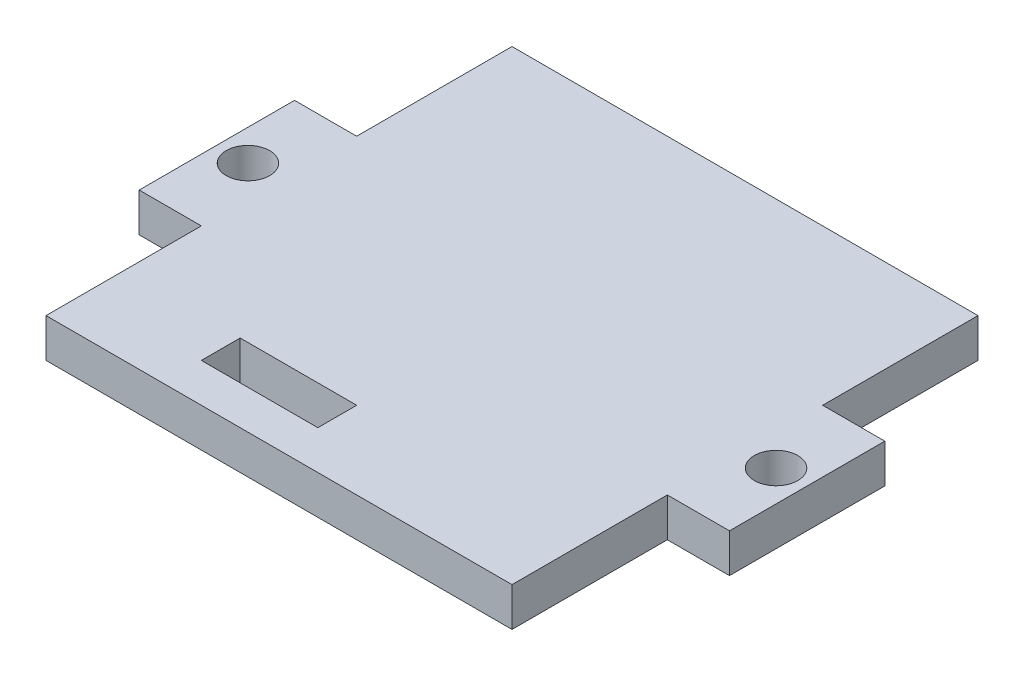
ISO-10303-21;
HEADER;
FILE_DESCRIPTION(('STEP AP214'),'2;1');
FILE_NAME('part.step','',(''),(''),'','','');
FILE_SCHEMA(('AUTOMOTIVE_DESIGN { 1 0 10303 214 1 1 1 1 }'));
ENDSEC;
DATA;
#1=APPLICATION_CONTEXT('core data for automotive mechanical design processes');
#2=APPLICATION_PROTOCOL_DEFINITION('international standard','automotive_design',2000,#1);
#3=PRODUCT_CONTEXT('',#1,'mechanical');
#4=PRODUCT('Part','Part','',(#3));
#5=PRODUCT_RELATED_PRODUCT_CATEGORY('part','',(#4));
#6=PRODUCT_DEFINITION_FORMATION('','',#4);
#7=PRODUCT_DEFINITION_CONTEXT('part definition',#1,'design');
#8=PRODUCT_DEFINITION('design','',#6,#7);
#9=PRODUCT_DEFINITION_SHAPE('','',#8);
#10=(LENGTH_UNIT() NAMED_UNIT(*) SI_UNIT(.MILLI.,.METRE.));
#11=(NAMED_UNIT(*) PLANE_ANGLE_UNIT() SI_UNIT($,.RADIAN.));
#12=(NAMED_UNIT(*) SI_UNIT($,.STERADIAN.) SOLID_ANGLE_UNIT());
#13=UNCERTAINTY_MEASURE_WITH_UNIT(LENGTH_MEASURE(1.E-05),#10,'distance_accuracy_value','');
#14=(GEOMETRIC_REPRESENTATION_CONTEXT(3) GLOBAL_UNCERTAINTY_ASSIGNED_CONTEXT((#13)) GLOBAL_UNIT_ASSIGNED_CONTEXT((#10,
#11,#12)) REPRESENTATION_CONTEXT('',''));
#15=CARTESIAN_POINT('',(0.,0.,0.));
#16=DIRECTION('',(0.,0.,1.));
#17=DIRECTION('',(1.,0.,0.));
#18=AXIS2_PLACEMENT_3D('',#15,#16,#17);
#19=CARTESIAN_POINT('',(0.,3.175,0.));
#20=DIRECTION('',(0.,-1.,0.));
#21=DIRECTION('',(0.,0.,-1.));
#22=AXIS2_PLACEMENT_3D('',#19,#20,#21);
#23=PLANE('',#22);
#24=CARTESIAN_POINT('',(40.64,3.175,-19.05));
#25=DIRECTION('',(0.,1.,0.));
#26=DIRECTION('',(0.,0.,1.));
#27=AXIS2_PLACEMENT_3D('',#24,#25,#26);
#28=CIRCLE('',#27,1.778);
#29=CARTESIAN_POINT('',(40.64,3.175,-17.272));
#30=VERTEX_POINT('',#29);
#31=EDGE_CURVE('E182',#30,#30,#28,.T.);
#32=ORIENTED_EDGE('',*,*,#31,.F.);
#33=EDGE_LOOP('',(#32));
#34=FACE_BOUND('',#33,.T.);
#35=DIRECTION('',(1.,0.,0.));
#36=VECTOR('',#35,1.);
#37=CARTESIAN_POINT('',(38.1,3.175,0.));
#38=LINE('',#37,#36);
#39=CARTESIAN_POINT('',(0.,3.175,0.));
#40=VERTEX_POINT('',#39);
#41=CARTESIAN_POINT('',(38.1,3.175,0.));
#42=VERTEX_POINT('',#41);
#43=EDGE_CURVE('E194',#40,#42,#38,.T.);
#44=ORIENTED_EDGE('',*,*,#43,.T.);
#45=DIRECTION('',(0.,0.,-1.));
#46=VECTOR('',#45,1.);
#47=CARTESIAN_POINT('',(38.1,3.175,-12.7));
#48=LINE('',#47,#46);
#49=CARTESIAN_POINT('',(38.1,3.175,-12.7));
#50=VERTEX_POINT('',#49);
#51=EDGE_CURVE('E197',#42,#50,#48,.T.);
#52=ORIENTED_EDGE('',*,*,#51,.T.);
#53=DIRECTION('',(1.,0.,0.));
#54=VECTOR('',#53,1.);
#55=CARTESIAN_POINT('',(38.1,3.175,-12.7));
#56=LINE('',#55,#54);
#57=CARTESIAN_POINT('',(43.18,3.175,-12.7));
#58=VERTEX_POINT('',#57);
#59=EDGE_CURVE('E200',#50,#58,#56,.T.);
#60=ORIENTED_EDGE('',*,*,#59,.T.);
#61=DIRECTION('',(0.,0.,-1.));
#62=VECTOR('',#61,1.);
#63=CARTESIAN_POINT('',(43.18,3.175,-12.7));
#64=LINE('',#63,#62);
#65=CARTESIAN_POINT('',(43.18,3.175,-25.4));
#66=VERTEX_POINT('',#65);
#67=EDGE_CURVE('E202',#58,#66,#64,.T.);
#68=ORIENTED_EDGE('',*,*,#67,.T.);
#69=DIRECTION('',(-1.,0.,0.));
#70=VECTOR('',#69,1.);
#71=CARTESIAN_POINT('',(43.18,3.175,-25.4));
#72=LINE('',#71,#70);
#73=CARTESIAN_POINT('',(38.1,3.175,-25.4));
#74=VERTEX_POINT('',#73);
#75=EDGE_CURVE('E204',#66,#74,#72,.T.);
#76=ORIENTED_EDGE('',*,*,#75,.T.);
#77=DIRECTION('',(0.,0.,-1.));
#78=VECTOR('',#77,1.);
#79=CARTESIAN_POINT('',(38.1,3.175,-38.1));
#80=LINE('',#79,#78);
#81=CARTESIAN_POINT('',(38.1,3.175,-38.1));
#82=VERTEX_POINT('',#81);
#83=EDGE_CURVE('E206',#74,#82,#80,.T.);
#84=ORIENTED_EDGE('',*,*,#83,.T.);
#85=DIRECTION('',(-1.,0.,0.));
#86=VECTOR('',#85,1.);
#87=CARTESIAN_POINT('',(0.,3.175,-38.1));
#88=LINE('',#87,#86);
#89=CARTESIAN_POINT('',(0.,3.175,-38.1));
#90=VERTEX_POINT('',#89);
#91=EDGE_CURVE('E208',#82,#90,#88,.T.);
#92=ORIENTED_EDGE('',*,*,#91,.T.);
#93=DIRECTION('',(0.,0.,1.));
#94=VECTOR('',#93,1.);
#95=CARTESIAN_POINT('',(0.,3.175,-25.4));
#96=LINE('',#95,#94);
#97=CARTESIAN_POINT('',(0.,3.175,-25.4));
#98=VERTEX_POINT('',#97);
#99=EDGE_CURVE('E210',#90,#98,#96,.T.);
#100=ORIENTED_EDGE('',*,*,#99,.T.);
#101=DIRECTION('',(-1.,0.,0.));
#102=VECTOR('',#101,1.);
#103=CARTESIAN_POINT('',(0.,3.175,-25.4));
#104=LINE('',#103,#102);
#105=CARTESIAN_POINT('',(-5.08,3.175,-25.4));
#106=VERTEX_POINT('',#105);
#107=EDGE_CURVE('E212',#98,#106,#104,.T.);
#108=ORIENTED_EDGE('',*,*,#107,.T.);
#109=DIRECTION('',(0.,0.,1.));
#110=VECTOR('',#109,1.);
#111=CARTESIAN_POINT('',(-5.08,3.175,-25.4));
#112=LINE('',#111,#110);
#113=CARTESIAN_POINT('',(-5.08,3.175,-12.7));
#114=VERTEX_POINT('',#113);
#115=EDGE_CURVE('E214',#106,#114,#112,.T.);
#116=ORIENTED_EDGE('',*,*,#115,.T.);
#117=DIRECTION('',(1.,0.,0.));
#118=VECTOR('',#117,1.);
#119=CARTESIAN_POINT('',(-5.08,3.175,-12.7));
#120=LINE('',#119,#118);
#121=CARTESIAN_POINT('',(0.,3.175,-12.7));
#122=VERTEX_POINT('',#121);
#123=EDGE_CURVE('E216',#114,#122,#120,.T.);
#124=ORIENTED_EDGE('',*,*,#123,.T.);
#125=DIRECTION('',(0.,0.,1.));
#126=VECTOR('',#125,1.);
#127=CARTESIAN_POINT('',(0.,3.175,0.));
#128=LINE('',#127,#126);
#129=EDGE_CURVE('E218',#122,#40,#128,.T.);
#130=ORIENTED_EDGE('',*,*,#129,.T.);
#131=EDGE_LOOP('',(#44,#52,#60,#68,#76,#84,#92,#100,#108,#116,#124,#130));
#132=FACE_BOUND('',#131,.T.);
#133=CARTESIAN_POINT('',(-2.54,3.175,-19.05));
#134=DIRECTION('',(0.,1.,0.));
#135=DIRECTION('',(0.,0.,1.));
#136=AXIS2_PLACEMENT_3D('',#133,#134,#135);
#137=CIRCLE('',#136,1.778);
#138=CARTESIAN_POINT('',(-2.54,3.175,-17.272));
#139=VERTEX_POINT('',#138);
#140=EDGE_CURVE('E188',#139,#139,#137,.T.);
#141=ORIENTED_EDGE('',*,*,#140,.F.);
#142=EDGE_LOOP('',(#141));
#143=FACE_BOUND('',#142,.T.);
#144=DIRECTION('',(0.,0.,1.));
#145=VECTOR('',#144,1.);
#146=CARTESIAN_POINT('',(9.525,3.175,-6.35));
#147=LINE('',#146,#145);
#148=CARTESIAN_POINT('',(9.525,3.175,-6.35));
#149=VERTEX_POINT('',#148);
#150=CARTESIAN_POINT('',(9.525,3.175,-3.175));
#151=VERTEX_POINT('',#150);
#152=EDGE_CURVE('E146',#149,#151,#147,.T.);
#153=ORIENTED_EDGE('',*,*,#152,.F.);
#154=DIRECTION('',(-1.,0.,0.));
#155=VECTOR('',#154,1.);
#156=CARTESIAN_POINT('',(9.525,3.175,-6.35));
#157=LINE('',#156,#155);
#158=CARTESIAN_POINT('',(19.05,3.175,-6.35));
#159=VERTEX_POINT('',#158);
#160=EDGE_CURVE('E168',#159,#149,#157,.T.);
#161=ORIENTED_EDGE('',*,*,#160,.F.);
#162=DIRECTION('',(0.,0.,-1.));
#163=VECTOR('',#162,1.);
#164=CARTESIAN_POINT('',(19.05,3.175,-6.35));
#165=LINE('',#164,#163);
#166=CARTESIAN_POINT('',(19.05,3.175,-3.175));
#167=VERTEX_POINT('',#166);
#168=EDGE_CURVE('E166',#167,#159,#165,.T.);
#169=ORIENTED_EDGE('',*,*,#168,.F.);
#170=DIRECTION('',(1.,0.,0.));
#171=VECTOR('',#170,1.);
#172=CARTESIAN_POINT('',(9.525,3.175,-3.175));
#173=LINE('',#172,#171);
#174=EDGE_CURVE('E154',#151,#167,#173,.T.);
#175=ORIENTED_EDGE('',*,*,#174,.F.);
#176=EDGE_LOOP('',(#153,#161,#169,#175));
#177=FACE_BOUND('',#176,.T.);
#178=ADVANCED_FACE('F33',(#34,#132,#143,#177),#23,.F.);
#179=CARTESIAN_POINT('',(0.,0.,0.));
#180=DIRECTION('',(0.,-1.,0.));
#181=DIRECTION('',(0.,0.,-1.));
#182=AXIS2_PLACEMENT_3D('',#179,#180,#181);
#183=PLANE('',#182);
#184=CARTESIAN_POINT('',(40.64,0.,-19.05));
#185=DIRECTION('',(0.,1.,0.));
#186=DIRECTION('',(0.,0.,1.));
#187=AXIS2_PLACEMENT_3D('',#184,#185,#186);
#188=CIRCLE('',#187,1.778);
#189=CARTESIAN_POINT('',(40.64,0.,-17.272));
#190=VERTEX_POINT('',#189);
#191=EDGE_CURVE('E162',#190,#190,#188,.T.);
#192=ORIENTED_EDGE('',*,*,#191,.T.);
#193=EDGE_LOOP('',(#192));
#194=FACE_BOUND('',#193,.T.);
#195=DIRECTION('',(1.,0.,0.));
#196=VECTOR('',#195,1.);
#197=CARTESIAN_POINT('',(38.1,0.,0.));
#198=LINE('',#197,#196);
#199=CARTESIAN_POINT('',(0.,0.,0.));
#200=VERTEX_POINT('',#199);
#201=CARTESIAN_POINT('',(38.1,0.,0.));
#202=VERTEX_POINT('',#201);
#203=EDGE_CURVE('E191',#200,#202,#198,.T.);
#204=ORIENTED_EDGE('',*,*,#203,.F.);
#205=DIRECTION('',(0.,0.,1.));
#206=VECTOR('',#205,1.);
#207=CARTESIAN_POINT('',(0.,0.,0.));
#208=LINE('',#207,#206);
#209=CARTESIAN_POINT('',(0.,0.,-12.7));
#210=VERTEX_POINT('',#209);
#211=EDGE_CURVE('E198',#210,#200,#208,.T.);
#212=ORIENTED_EDGE('',*,*,#211,.F.);
#213=DIRECTION('',(1.,0.,0.));
#214=VECTOR('',#213,1.);
#215=CARTESIAN_POINT('',(-5.08,0.,-12.7));
#216=LINE('',#215,#214);
#217=CARTESIAN_POINT('',(-5.08,0.,-12.7));
#218=VERTEX_POINT('',#217);
#219=EDGE_CURVE('E241',#218,#210,#216,.T.);
#220=ORIENTED_EDGE('',*,*,#219,.F.);
#221=DIRECTION('',(0.,0.,1.));
#222=VECTOR('',#221,1.);
#223=CARTESIAN_POINT('',(-5.08,0.,-25.4));
#224=LINE('',#223,#222);
#225=CARTESIAN_POINT('',(-5.08,0.,-25.4));
#226=VERTEX_POINT('',#225);
#227=EDGE_CURVE('E239',#226,#218,#224,.T.);
#228=ORIENTED_EDGE('',*,*,#227,.F.);
#229=DIRECTION('',(-1.,0.,0.));
#230=VECTOR('',#229,1.);
#231=CARTESIAN_POINT('',(0.,0.,-25.4));
#232=LINE('',#231,#230);
#233=CARTESIAN_POINT('',(0.,0.,-25.4));
#234=VERTEX_POINT('',#233);
#235=EDGE_CURVE('E237',#234,#226,#232,.T.);
#236=ORIENTED_EDGE('',*,*,#235,.F.);
#237=DIRECTION('',(0.,0.,1.));
#238=VECTOR('',#237,1.);
#239=CARTESIAN_POINT('',(0.,0.,-25.4));
#240=LINE('',#239,#238);
#241=CARTESIAN_POINT('',(0.,0.,-38.1));
#242=VERTEX_POINT('',#241);
#243=EDGE_CURVE('E235',#242,#234,#240,.T.);
#244=ORIENTED_EDGE('',*,*,#243,.F.);
#245=DIRECTION('',(-1.,0.,0.));
#246=VECTOR('',#245,1.);
#247=CARTESIAN_POINT('',(0.,0.,-38.1));
#248=LINE('',#247,#246);
#249=CARTESIAN_POINT('',(38.1,0.,-38.1));
#250=VERTEX_POINT('',#249);
#251=EDGE_CURVE('E233',#250,#242,#248,.T.);
#252=ORIENTED_EDGE('',*,*,#251,.F.);
#253=DIRECTION('',(0.,0.,-1.));
#254=VECTOR('',#253,1.);
#255=CARTESIAN_POINT('',(38.1,0.,-38.1));
#256=LINE('',#255,#254);
#257=CARTESIAN_POINT('',(38.1,0.,-25.4));
#258=VERTEX_POINT('',#257);
#259=EDGE_CURVE('E231',#258,#250,#256,.T.);
#260=ORIENTED_EDGE('',*,*,#259,.F.);
#261=DIRECTION('',(-1.,0.,0.));
#262=VECTOR('',#261,1.);
#263=CARTESIAN_POINT('',(43.18,0.,-25.4));
#264=LINE('',#263,#262);
#265=CARTESIAN_POINT('',(43.18,0.,-25.4));
#266=VERTEX_POINT('',#265);
#267=EDGE_CURVE('E229',#266,#258,#264,.T.);
#268=ORIENTED_EDGE('',*,*,#267,.F.);
#269=DIRECTION('',(0.,0.,-1.));
#270=VECTOR('',#269,1.);
#271=CARTESIAN_POINT('',(43.18,0.,-12.7));
#272=LINE('',#271,#270);
#273=CARTESIAN_POINT('',(43.18,0.,-12.7));
#274=VERTEX_POINT('',#273);
#275=EDGE_CURVE('E227',#274,#266,#272,.T.);
#276=ORIENTED_EDGE('',*,*,#275,.F.);
#277=DIRECTION('',(1.,0.,0.));
#278=VECTOR('',#277,1.);
#279=CARTESIAN_POINT('',(38.1,0.,-12.7));
#280=LINE('',#279,#278);
#281=CARTESIAN_POINT('',(38.1,0.,-12.7));
#282=VERTEX_POINT('',#281);
#283=EDGE_CURVE('E225',#282,#274,#280,.T.);
#284=ORIENTED_EDGE('',*,*,#283,.F.);
#285=DIRECTION('',(0.,0.,-1.));
#286=VECTOR('',#285,1.);
#287=CARTESIAN_POINT('',(38.1,0.,-12.7));
#288=LINE('',#287,#286);
#289=EDGE_CURVE('E223',#202,#282,#288,.T.);
#290=ORIENTED_EDGE('',*,*,#289,.F.);
#291=EDGE_LOOP('',(#204,#212,#220,#228,#236,#244,#252,#260,#268,#276,#284,#290));
#292=FACE_BOUND('',#291,.T.);
#293=CARTESIAN_POINT('',(-2.54,0.,-19.05));
#294=DIRECTION('',(0.,1.,0.));
#295=DIRECTION('',(0.,0.,1.));
#296=AXIS2_PLACEMENT_3D('',#293,#294,#295);
#297=CIRCLE('',#296,1.778);
#298=CARTESIAN_POINT('',(-2.54,0.,-17.272));
#299=VERTEX_POINT('',#298);
#300=EDGE_CURVE('E185',#299,#299,#297,.T.);
#301=ORIENTED_EDGE('',*,*,#300,.T.);
#302=EDGE_LOOP('',(#301));
#303=FACE_BOUND('',#302,.T.);
#304=DIRECTION('',(-1.,0.,0.));
#305=VECTOR('',#304,1.);
#306=CARTESIAN_POINT('',(9.525,0.,-6.35));
#307=LINE('',#306,#305);
#308=CARTESIAN_POINT('',(19.05,0.,-6.35));
#309=VERTEX_POINT('',#308);
#310=CARTESIAN_POINT('',(9.525,0.,-6.35));
#311=VERTEX_POINT('',#310);
#312=EDGE_CURVE('E155',#309,#311,#307,.T.);
#313=ORIENTED_EDGE('',*,*,#312,.T.);
#314=DIRECTION('',(0.,0.,1.));
#315=VECTOR('',#314,1.);
#316=CARTESIAN_POINT('',(9.525,0.,-6.35));
#317=LINE('',#316,#315);
#318=CARTESIAN_POINT('',(9.525,0.,-3.175));
#319=VERTEX_POINT('',#318);
#320=EDGE_CURVE('E56',#311,#319,#317,.T.);
#321=ORIENTED_EDGE('',*,*,#320,.T.);
#322=DIRECTION('',(1.,0.,0.));
#323=VECTOR('',#322,1.);
#324=CARTESIAN_POINT('',(9.525,0.,-3.175));
#325=LINE('',#324,#323);
#326=CARTESIAN_POINT('',(19.05,0.,-3.175));
#327=VERTEX_POINT('',#326);
#328=EDGE_CURVE('E161',#319,#327,#325,.T.);
#329=ORIENTED_EDGE('',*,*,#328,.T.);
#330=DIRECTION('',(0.,0.,-1.));
#331=VECTOR('',#330,1.);
#332=CARTESIAN_POINT('',(19.05,0.,-6.35));
#333=LINE('',#332,#331);
#334=EDGE_CURVE('E174',#327,#309,#333,.T.);
#335=ORIENTED_EDGE('',*,*,#334,.T.);
#336=EDGE_LOOP('',(#313,#321,#329,#335));
#337=FACE_BOUND('',#336,.T.);
#338=ADVANCED_FACE('F283',(#194,#292,#303,#337),#183,.T.);
#339=CARTESIAN_POINT('',(38.1,3.175,0.));
#340=DIRECTION('',(0.,0.,-1.));
#341=DIRECTION('',(-1.,0.,0.));
#342=AXIS2_PLACEMENT_3D('',#339,#340,#341);
#343=PLANE('',#342);
#344=ORIENTED_EDGE('',*,*,#203,.T.);
#345=DIRECTION('',(0.,-1.,0.));
#346=VECTOR('',#345,1.);
#347=CARTESIAN_POINT('',(38.1,3.175,0.));
#348=LINE('',#347,#346);
#349=EDGE_CURVE('E11',#42,#202,#348,.T.);
#350=ORIENTED_EDGE('',*,*,#349,.F.);
#351=ORIENTED_EDGE('',*,*,#43,.F.);
#352=DIRECTION('',(0.,-1.,0.));
#353=VECTOR('',#352,1.);
#354=CARTESIAN_POINT('',(0.,3.175,0.));
#355=LINE('',#354,#353);
#356=EDGE_CURVE('E220',#40,#200,#355,.T.);
#357=ORIENTED_EDGE('',*,*,#356,.T.);
#358=EDGE_LOOP('',(#344,#350,#351,#357));
#359=FACE_BOUND('',#358,.T.);
#360=ADVANCED_FACE('F35',(#359),#343,.F.);
#361=CARTESIAN_POINT('',(38.1,3.175,-12.7));
#362=DIRECTION('',(-1.,0.,0.));
#363=DIRECTION('',(0.,0.,1.));
#364=AXIS2_PLACEMENT_3D('',#361,#362,#363);
#365=PLANE('',#364);
#366=ORIENTED_EDGE('',*,*,#289,.T.);
#367=DIRECTION('',(0.,-1.,0.));
#368=VECTOR('',#367,1.);
#369=CARTESIAN_POINT('',(38.1,3.175,-12.7));
#370=LINE('',#369,#368);
#371=EDGE_CURVE('E41',#50,#282,#370,.T.);
#372=ORIENTED_EDGE('',*,*,#371,.F.);
#373=ORIENTED_EDGE('',*,*,#51,.F.);
#374=ORIENTED_EDGE('',*,*,#349,.T.);
#375=EDGE_LOOP('',(#366,#372,#373,#374));
#376=FACE_BOUND('',#375,.T.);
#377=ADVANCED_FACE('F301',(#376),#365,.F.);
#378=CARTESIAN_POINT('',(38.1,3.175,-12.7));
#379=DIRECTION('',(0.,0.,-1.));
#380=DIRECTION('',(-1.,0.,0.));
#381=AXIS2_PLACEMENT_3D('',#378,#379,#380);
#382=PLANE('',#381);
#383=ORIENTED_EDGE('',*,*,#283,.T.);
#384=DIRECTION('',(0.,-1.,0.));
#385=VECTOR('',#384,1.);
#386=CARTESIAN_POINT('',(43.18,3.175,-12.7));
#387=LINE('',#386,#385);
#388=EDGE_CURVE('E270',#58,#274,#387,.T.);
#389=ORIENTED_EDGE('',*,*,#388,.F.);
#390=ORIENTED_EDGE('',*,*,#59,.F.);
#391=ORIENTED_EDGE('',*,*,#371,.T.);
#392=EDGE_LOOP('',(#383,#389,#390,#391));
#393=FACE_BOUND('',#392,.T.);
#394=ADVANCED_FACE('F277',(#393),#382,.F.);
#395=CARTESIAN_POINT('',(43.18,3.175,-12.7));
#396=DIRECTION('',(-1.,0.,0.));
#397=DIRECTION('',(0.,0.,1.));
#398=AXIS2_PLACEMENT_3D('',#395,#396,#397);
#399=PLANE('',#398);
#400=ORIENTED_EDGE('',*,*,#275,.T.);
#401=DIRECTION('',(0.,-1.,0.));
#402=VECTOR('',#401,1.);
#403=CARTESIAN_POINT('',(43.18,3.175,-25.4));
#404=LINE('',#403,#402);
#405=EDGE_CURVE('E267',#66,#266,#404,.T.);
#406=ORIENTED_EDGE('',*,*,#405,.F.);
#407=ORIENTED_EDGE('',*,*,#67,.F.);
#408=ORIENTED_EDGE('',*,*,#388,.T.);
#409=EDGE_LOOP('',(#400,#406,#407,#408));
#410=FACE_BOUND('',#409,.T.);
#411=ADVANCED_FACE('F289',(#410),#399,.F.);
#412=CARTESIAN_POINT('',(43.18,3.175,-25.4));
#413=DIRECTION('',(0.,0.,1.));
#414=DIRECTION('',(1.,0.,0.));
#415=AXIS2_PLACEMENT_3D('',#412,#413,#414);
#416=PLANE('',#415);
#417=ORIENTED_EDGE('',*,*,#267,.T.);
#418=DIRECTION('',(0.,-1.,0.));
#419=VECTOR('',#418,1.);
#420=CARTESIAN_POINT('',(38.1,3.175,-25.4));
#421=LINE('',#420,#419);
#422=EDGE_CURVE('E264',#74,#258,#421,.T.);
#423=ORIENTED_EDGE('',*,*,#422,.F.);
#424=ORIENTED_EDGE('',*,*,#75,.F.);
#425=ORIENTED_EDGE('',*,*,#405,.T.);
#426=EDGE_LOOP('',(#417,#423,#424,#425));
#427=FACE_BOUND('',#426,.T.);
#428=ADVANCED_FACE('F293',(#427),#416,.F.);
#429=CARTESIAN_POINT('',(38.1,3.175,-38.1));
#430=DIRECTION('',(-1.,0.,0.));
#431=DIRECTION('',(0.,0.,1.));
#432=AXIS2_PLACEMENT_3D('',#429,#430,#431);
#433=PLANE('',#432);
#434=ORIENTED_EDGE('',*,*,#259,.T.);
#435=DIRECTION('',(0.,-1.,0.));
#436=VECTOR('',#435,1.);
#437=CARTESIAN_POINT('',(38.1,3.175,-38.1));
#438=LINE('',#437,#436);
#439=EDGE_CURVE('E261',#82,#250,#438,.T.);
#440=ORIENTED_EDGE('',*,*,#439,.F.);
#441=ORIENTED_EDGE('',*,*,#83,.F.);
#442=ORIENTED_EDGE('',*,*,#422,.T.);
#443=EDGE_LOOP('',(#434,#440,#441,#442));
#444=FACE_BOUND('',#443,.T.);
#445=ADVANCED_FACE('F334',(#444),#433,.F.);
#446=CARTESIAN_POINT('',(0.,3.175,-38.1));
#447=DIRECTION('',(0.,0.,1.));
#448=DIRECTION('',(1.,0.,0.));
#449=AXIS2_PLACEMENT_3D('',#446,#447,#448);
#450=PLANE('',#449);
#451=ORIENTED_EDGE('',*,*,#251,.T.);
#452=DIRECTION('',(0.,-1.,0.));
#453=VECTOR('',#452,1.);
#454=CARTESIAN_POINT('',(0.,3.175,-38.1));
#455=LINE('',#454,#453);
#456=EDGE_CURVE('E258',#90,#242,#455,.T.);
#457=ORIENTED_EDGE('',*,*,#456,.F.);
#458=ORIENTED_EDGE('',*,*,#91,.F.);
#459=ORIENTED_EDGE('',*,*,#439,.T.);
#460=EDGE_LOOP('',(#451,#457,#458,#459));
#461=FACE_BOUND('',#460,.T.);
#462=ADVANCED_FACE('F332',(#461),#450,.F.);
#463=CARTESIAN_POINT('',(0.,3.175,-25.4));
#464=DIRECTION('',(1.,0.,0.));
#465=DIRECTION('',(0.,0.,-1.));
#466=AXIS2_PLACEMENT_3D('',#463,#464,#465);
#467=PLANE('',#466);
#468=ORIENTED_EDGE('',*,*,#243,.T.);
#469=DIRECTION('',(0.,-1.,0.));
#470=VECTOR('',#469,1.);
#471=CARTESIAN_POINT('',(0.,3.175,-25.4));
#472=LINE('',#471,#470);
#473=EDGE_CURVE('E255',#98,#234,#472,.T.);
#474=ORIENTED_EDGE('',*,*,#473,.F.);
#475=ORIENTED_EDGE('',*,*,#99,.F.);
#476=ORIENTED_EDGE('',*,*,#456,.T.);
#477=EDGE_LOOP('',(#468,#474,#475,#476));
#478=FACE_BOUND('',#477,.T.);
#479=ADVANCED_FACE('F328',(#478),#467,.F.);
#480=CARTESIAN_POINT('',(0.,3.175,-25.4));
#481=DIRECTION('',(0.,0.,1.));
#482=DIRECTION('',(1.,0.,0.));
#483=AXIS2_PLACEMENT_3D('',#480,#481,#482);
#484=PLANE('',#483);
#485=ORIENTED_EDGE('',*,*,#235,.T.);
#486=DIRECTION('',(0.,-1.,0.));
#487=VECTOR('',#486,1.);
#488=CARTESIAN_POINT('',(-5.08,3.175,-25.4));
#489=LINE('',#488,#487);
#490=EDGE_CURVE('E252',#106,#226,#489,.T.);
#491=ORIENTED_EDGE('',*,*,#490,.F.);
#492=ORIENTED_EDGE('',*,*,#107,.F.);
#493=ORIENTED_EDGE('',*,*,#473,.T.);
#494=EDGE_LOOP('',(#485,#491,#492,#493));
#495=FACE_BOUND('',#494,.T.);
#496=ADVANCED_FACE('F323',(#495),#484,.F.);
#497=CARTESIAN_POINT('',(-5.08,3.175,-25.4));
#498=DIRECTION('',(1.,0.,0.));
#499=DIRECTION('',(0.,0.,-1.));
#500=AXIS2_PLACEMENT_3D('',#497,#498,#499);
#501=PLANE('',#500);
#502=ORIENTED_EDGE('',*,*,#227,.T.);
#503=DIRECTION('',(0.,-1.,0.));
#504=VECTOR('',#503,1.);
#505=CARTESIAN_POINT('',(-5.08,3.175,-12.7));
#506=LINE('',#505,#504);
#507=EDGE_CURVE('E249',#114,#218,#506,.T.);
#508=ORIENTED_EDGE('',*,*,#507,.F.);
#509=ORIENTED_EDGE('',*,*,#115,.F.);
#510=ORIENTED_EDGE('',*,*,#490,.T.);
#511=EDGE_LOOP('',(#502,#508,#509,#510));
#512=FACE_BOUND('',#511,.T.);
#513=ADVANCED_FACE('F317',(#512),#501,.F.);
#514=CARTESIAN_POINT('',(-5.08,3.175,-12.7));
#515=DIRECTION('',(0.,0.,-1.));
#516=DIRECTION('',(-1.,0.,0.));
#517=AXIS2_PLACEMENT_3D('',#514,#515,#516);
#518=PLANE('',#517);
#519=ORIENTED_EDGE('',*,*,#219,.T.);
#520=DIRECTION('',(0.,-1.,0.));
#521=VECTOR('',#520,1.);
#522=CARTESIAN_POINT('',(0.,3.175,-12.7));
#523=LINE('',#522,#521);
#524=EDGE_CURVE('E246',#122,#210,#523,.T.);
#525=ORIENTED_EDGE('',*,*,#524,.F.);
#526=ORIENTED_EDGE('',*,*,#123,.F.);
#527=ORIENTED_EDGE('',*,*,#507,.T.);
#528=EDGE_LOOP('',(#519,#525,#526,#527));
#529=FACE_BOUND('',#528,.T.);
#530=ADVANCED_FACE('F313',(#529),#518,.F.);
#531=CARTESIAN_POINT('',(0.,3.175,0.));
#532=DIRECTION('',(1.,0.,0.));
#533=DIRECTION('',(0.,0.,-1.));
#534=AXIS2_PLACEMENT_3D('',#531,#532,#533);
#535=PLANE('',#534);
#536=ORIENTED_EDGE('',*,*,#211,.T.);
#537=ORIENTED_EDGE('',*,*,#356,.F.);
#538=ORIENTED_EDGE('',*,*,#129,.F.);
#539=ORIENTED_EDGE('',*,*,#524,.T.);
#540=EDGE_LOOP('',(#536,#537,#538,#539));
#541=FACE_BOUND('',#540,.T.);
#542=ADVANCED_FACE('F308',(#541),#535,.F.);
#543=CARTESIAN_POINT('',(-2.54,3.175,-19.05));
#544=DIRECTION('',(0.,-1.,0.));
#545=DIRECTION('',(0.,0.,-1.));
#546=AXIS2_PLACEMENT_3D('',#543,#544,#545);
#547=CYLINDRICAL_SURFACE('',#546,1.778);
#548=ORIENTED_EDGE('',*,*,#140,.T.);
#549=EDGE_LOOP('',(#548));
#550=FACE_BOUND('',#549,.T.);
#551=ORIENTED_EDGE('',*,*,#300,.F.);
#552=EDGE_LOOP('',(#551));
#553=FACE_BOUND('',#552,.T.);
#554=ADVANCED_FACE('F353',(#550,#553),#547,.F.);
#555=CARTESIAN_POINT('',(40.64,3.175,-19.05));
#556=DIRECTION('',(0.,-1.,0.));
#557=DIRECTION('',(0.,0.,-1.));
#558=AXIS2_PLACEMENT_3D('',#555,#556,#557);
#559=CYLINDRICAL_SURFACE('',#558,1.778);
#560=ORIENTED_EDGE('',*,*,#31,.T.);
#561=EDGE_LOOP('',(#560));
#562=FACE_BOUND('',#561,.T.);
#563=ORIENTED_EDGE('',*,*,#191,.F.);
#564=EDGE_LOOP('',(#563));
#565=FACE_BOUND('',#564,.T.);
#566=ADVANCED_FACE('F391',(#562,#565),#559,.F.);
#567=CARTESIAN_POINT('',(9.525,3.175,-6.35));
#568=DIRECTION('',(1.,0.,0.));
#569=DIRECTION('',(0.,0.,-1.));
#570=AXIS2_PLACEMENT_3D('',#567,#568,#569);
#571=PLANE('',#570);
#572=ORIENTED_EDGE('',*,*,#320,.F.);
#573=DIRECTION('',(0.,-1.,0.));
#574=VECTOR('',#573,1.);
#575=CARTESIAN_POINT('',(9.525,3.175,-6.35));
#576=LINE('',#575,#574);
#577=EDGE_CURVE('E150',#149,#311,#576,.T.);
#578=ORIENTED_EDGE('',*,*,#577,.F.);
#579=ORIENTED_EDGE('',*,*,#152,.T.);
#580=DIRECTION('',(0.,-1.,0.));
#581=VECTOR('',#580,1.);
#582=CARTESIAN_POINT('',(9.525,3.175,-3.175));
#583=LINE('',#582,#581);
#584=EDGE_CURVE('E149',#151,#319,#583,.T.);
#585=ORIENTED_EDGE('',*,*,#584,.T.);
#586=EDGE_LOOP('',(#572,#578,#579,#585));
#587=FACE_BOUND('',#586,.T.);
#588=ADVANCED_FACE('F148',(#587),#571,.T.);
#589=CARTESIAN_POINT('',(9.525,3.175,-3.175));
#590=DIRECTION('',(0.,0.,-1.));
#591=DIRECTION('',(-1.,0.,0.));
#592=AXIS2_PLACEMENT_3D('',#589,#590,#591);
#593=PLANE('',#592);
#594=ORIENTED_EDGE('',*,*,#328,.F.);
#595=ORIENTED_EDGE('',*,*,#584,.F.);
#596=ORIENTED_EDGE('',*,*,#174,.T.);
#597=DIRECTION('',(0.,-1.,0.));
#598=VECTOR('',#597,1.);
#599=CARTESIAN_POINT('',(19.05,3.175,-3.175));
#600=LINE('',#599,#598);
#601=EDGE_CURVE('E163',#167,#327,#600,.T.);
#602=ORIENTED_EDGE('',*,*,#601,.T.);
#603=EDGE_LOOP('',(#594,#595,#596,#602));
#604=FACE_BOUND('',#603,.T.);
#605=ADVANCED_FACE('F158',(#604),#593,.T.);
#606=CARTESIAN_POINT('',(19.05,3.175,-6.35));
#607=DIRECTION('',(-1.,0.,0.));
#608=DIRECTION('',(0.,0.,1.));
#609=AXIS2_PLACEMENT_3D('',#606,#607,#608);
#610=PLANE('',#609);
#611=ORIENTED_EDGE('',*,*,#334,.F.);
#612=ORIENTED_EDGE('',*,*,#601,.F.);
#613=ORIENTED_EDGE('',*,*,#168,.T.);
#614=DIRECTION('',(0.,-1.,0.));
#615=VECTOR('',#614,1.);
#616=CARTESIAN_POINT('',(19.05,3.175,-6.35));
#617=LINE('',#616,#615);
#618=EDGE_CURVE('E48',#159,#309,#617,.T.);
#619=ORIENTED_EDGE('',*,*,#618,.T.);
#620=EDGE_LOOP('',(#611,#612,#613,#619));
#621=FACE_BOUND('',#620,.T.);
#622=ADVANCED_FACE('F410',(#621),#610,.T.);
#623=CARTESIAN_POINT('',(9.525,3.175,-6.35));
#624=DIRECTION('',(0.,0.,1.));
#625=DIRECTION('',(1.,0.,0.));
#626=AXIS2_PLACEMENT_3D('',#623,#624,#625);
#627=PLANE('',#626);
#628=ORIENTED_EDGE('',*,*,#312,.F.);
#629=ORIENTED_EDGE('',*,*,#618,.F.);
#630=ORIENTED_EDGE('',*,*,#160,.T.);
#631=ORIENTED_EDGE('',*,*,#577,.T.);
#632=EDGE_LOOP('',(#628,#629,#630,#631));
#633=FACE_BOUND('',#632,.T.);
#634=ADVANCED_FACE('F417',(#633),#627,.T.);
#635=CLOSED_SHELL('',(#178,#338,#360,#377,#394,#411,#428,#445,#462,#479,#496,#513,#530,#542,
#554,#566,#588,#605,#622,#634));
#636=MANIFOLD_SOLID_BREP('B2',#635);
#637=ADVANCED_BREP_SHAPE_REPRESENTATION('',(#18,#636),#14);
#638=SHAPE_DEFINITION_REPRESENTATION(#9,#637);
ENDSEC;
END-ISO-10303-21;
